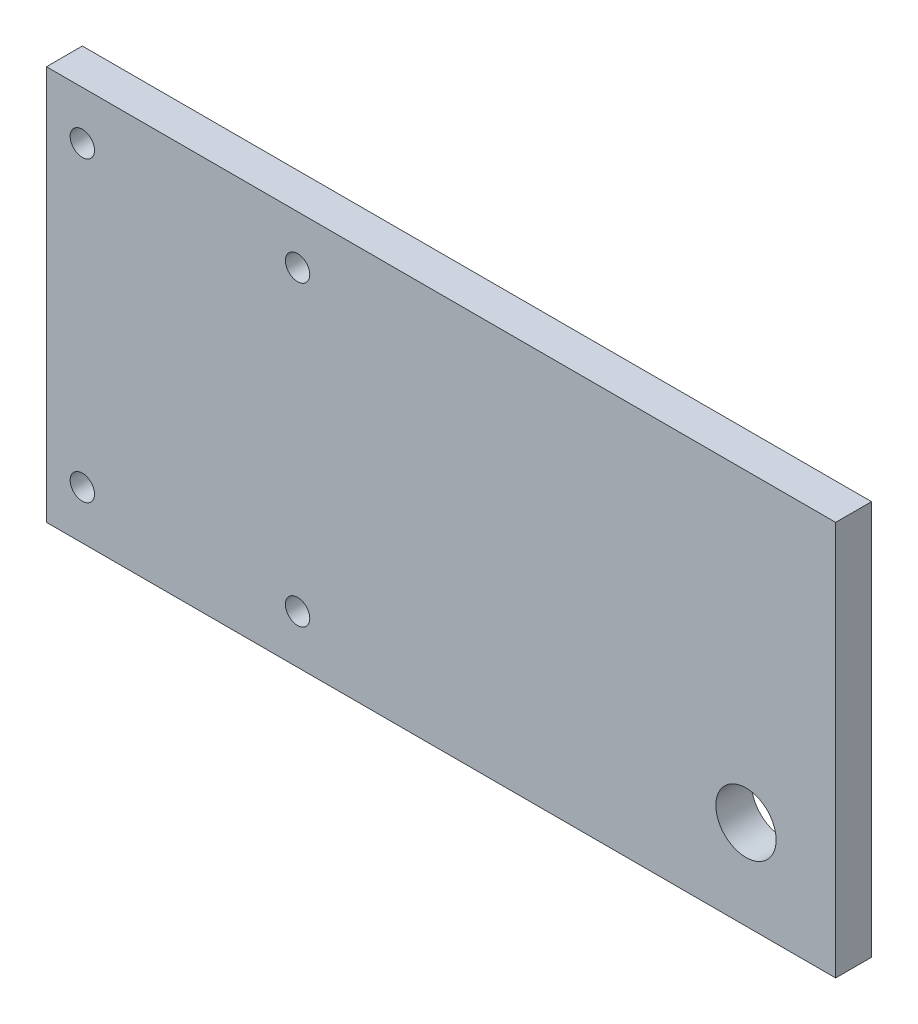
ISO-10303-21;
HEADER;
FILE_DESCRIPTION(('STEP AP214'),'2;1');
FILE_NAME('part.step','',(''),(''),'','','');
FILE_SCHEMA(('AUTOMOTIVE_DESIGN { 1 0 10303 214 1 1 1 1 }'));
ENDSEC;
DATA;
#1=APPLICATION_CONTEXT('core data for automotive mechanical design processes');
#2=APPLICATION_PROTOCOL_DEFINITION('international standard','automotive_design',2000,#1);
#3=PRODUCT_CONTEXT('',#1,'mechanical');
#4=PRODUCT('Part','Part','',(#3));
#5=PRODUCT_RELATED_PRODUCT_CATEGORY('part','',(#4));
#6=PRODUCT_DEFINITION_FORMATION('','',#4);
#7=PRODUCT_DEFINITION_CONTEXT('part definition',#1,'design');
#8=PRODUCT_DEFINITION('design','',#6,#7);
#9=PRODUCT_DEFINITION_SHAPE('','',#8);
#10=(LENGTH_UNIT() NAMED_UNIT(*) SI_UNIT(.MILLI.,.METRE.));
#11=(NAMED_UNIT(*) PLANE_ANGLE_UNIT() SI_UNIT($,.RADIAN.));
#12=(NAMED_UNIT(*) SI_UNIT($,.STERADIAN.) SOLID_ANGLE_UNIT());
#13=UNCERTAINTY_MEASURE_WITH_UNIT(LENGTH_MEASURE(1.E-05),#10,'distance_accuracy_value','');
#14=(GEOMETRIC_REPRESENTATION_CONTEXT(3) GLOBAL_UNCERTAINTY_ASSIGNED_CONTEXT((#13)) GLOBAL_UNIT_ASSIGNED_CONTEXT((#10,
#11,#12)) REPRESENTATION_CONTEXT('',''));
#15=CARTESIAN_POINT('',(0.,0.,0.));
#16=DIRECTION('',(0.,0.,1.));
#17=DIRECTION('',(1.,0.,0.));
#18=AXIS2_PLACEMENT_3D('',#15,#16,#17);
#19=CARTESIAN_POINT('',(0.,0.,2010.));
#20=DIRECTION('',(0.,0.,1.));
#21=DIRECTION('',(1.,0.,0.));
#22=AXIS2_PLACEMENT_3D('',#19,#20,#21);
#23=PLANE('',#22);
#24=CARTESIAN_POINT('',(250.,-403.5,2010.));
#25=DIRECTION('',(0.,0.,1.));
#26=DIRECTION('',(1.,0.,0.));
#27=AXIS2_PLACEMENT_3D('',#24,#25,#26);
#28=CIRCLE('',#27,3.40000000000003);
#29=CARTESIAN_POINT('',(253.4,-403.5,2010.));
#30=VERTEX_POINT('',#29);
#31=EDGE_CURVE('E109',#30,#30,#28,.T.);
#32=ORIENTED_EDGE('',*,*,#31,.F.);
#33=EDGE_LOOP('',(#32));
#34=FACE_BOUND('',#33,.T.);
#35=CARTESIAN_POINT('',(190.,-486.5,2010.));
#36=DIRECTION('',(0.,0.,1.));
#37=DIRECTION('',(1.,0.,0.));
#38=AXIS2_PLACEMENT_3D('',#35,#36,#37);
#39=CIRCLE('',#38,3.40000000000003);
#40=CARTESIAN_POINT('',(193.4,-486.5,2010.));
#41=VERTEX_POINT('',#40);
#42=EDGE_CURVE('E97',#41,#41,#39,.T.);
#43=ORIENTED_EDGE('',*,*,#42,.F.);
#44=EDGE_LOOP('',(#43));
#45=FACE_BOUND('',#44,.T.);
#46=DIRECTION('',(0.,1.,0.));
#47=VECTOR('',#46,1.);
#48=CARTESIAN_POINT('',(400.,-500.,2010.));
#49=LINE('',#48,#47);
#50=CARTESIAN_POINT('',(400.,-500.,2010.));
#51=VERTEX_POINT('',#50);
#52=CARTESIAN_POINT('',(400.,-390.,2010.));
#53=VERTEX_POINT('',#52);
#54=EDGE_CURVE('E67',#51,#53,#49,.T.);
#55=ORIENTED_EDGE('',*,*,#54,.T.);
#56=DIRECTION('',(-1.,0.,0.));
#57=VECTOR('',#56,1.);
#58=CARTESIAN_POINT('',(400.,-390.,2010.));
#59=LINE('',#58,#57);
#60=CARTESIAN_POINT('',(180.,-390.,2010.));
#61=VERTEX_POINT('',#60);
#62=EDGE_CURVE('E62',#53,#61,#59,.T.);
#63=ORIENTED_EDGE('',*,*,#62,.T.);
#64=DIRECTION('',(0.,-1.,0.));
#65=VECTOR('',#64,1.);
#66=CARTESIAN_POINT('',(180.,-500.,2010.));
#67=LINE('',#66,#65);
#68=CARTESIAN_POINT('',(180.,-500.,2010.));
#69=VERTEX_POINT('',#68);
#70=EDGE_CURVE('E65',#61,#69,#67,.T.);
#71=ORIENTED_EDGE('',*,*,#70,.T.);
#72=DIRECTION('',(1.,0.,0.));
#73=VECTOR('',#72,1.);
#74=CARTESIAN_POINT('',(400.,-500.,2010.));
#75=LINE('',#74,#73);
#76=EDGE_CURVE('E32',#69,#51,#75,.T.);
#77=ORIENTED_EDGE('',*,*,#76,.T.);
#78=EDGE_LOOP('',(#55,#63,#71,#77));
#79=FACE_BOUND('',#78,.T.);
#80=CARTESIAN_POINT('',(375.,-475.,2010.));
#81=DIRECTION('',(0.,0.,1.));
#82=DIRECTION('',(1.,0.,0.));
#83=AXIS2_PLACEMENT_3D('',#80,#81,#82);
#84=CIRCLE('',#83,8.40000000000002);
#85=CARTESIAN_POINT('',(383.4,-475.,2010.));
#86=VERTEX_POINT('',#85);
#87=EDGE_CURVE('E82',#86,#86,#84,.T.);
#88=ORIENTED_EDGE('',*,*,#87,.F.);
#89=EDGE_LOOP('',(#88));
#90=FACE_BOUND('',#89,.T.);
#91=CARTESIAN_POINT('',(190.,-403.5,2010.));
#92=DIRECTION('',(0.,0.,1.));
#93=DIRECTION('',(1.,0.,0.));
#94=AXIS2_PLACEMENT_3D('',#91,#92,#93);
#95=CIRCLE('',#94,3.40000000000003);
#96=CARTESIAN_POINT('',(193.4,-403.5,2010.));
#97=VERTEX_POINT('',#96);
#98=EDGE_CURVE('E103',#97,#97,#95,.T.);
#99=ORIENTED_EDGE('',*,*,#98,.F.);
#100=EDGE_LOOP('',(#99));
#101=FACE_BOUND('',#100,.T.);
#102=CARTESIAN_POINT('',(250.,-486.5,2010.));
#103=DIRECTION('',(0.,0.,1.));
#104=DIRECTION('',(1.,0.,0.));
#105=AXIS2_PLACEMENT_3D('',#102,#103,#104);
#106=CIRCLE('',#105,3.40000000000003);
#107=CARTESIAN_POINT('',(253.4,-486.5,2010.));
#108=VERTEX_POINT('',#107);
#109=EDGE_CURVE('E115',#108,#108,#106,.T.);
#110=ORIENTED_EDGE('',*,*,#109,.F.);
#111=EDGE_LOOP('',(#110));
#112=FACE_BOUND('',#111,.T.);
#113=ADVANCED_FACE('F15',(#34,#45,#79,#90,#101,#112),#23,.T.);
#114=CARTESIAN_POINT('',(0.,0.,2000.));
#115=DIRECTION('',(0.,0.,1.));
#116=DIRECTION('',(1.,0.,0.));
#117=AXIS2_PLACEMENT_3D('',#114,#115,#116);
#118=PLANE('',#117);
#119=DIRECTION('',(0.,1.,0.));
#120=VECTOR('',#119,1.);
#121=CARTESIAN_POINT('',(400.,-500.,2000.));
#122=LINE('',#121,#120);
#123=CARTESIAN_POINT('',(400.,-500.,2000.));
#124=VERTEX_POINT('',#123);
#125=CARTESIAN_POINT('',(400.,-390.,2000.));
#126=VERTEX_POINT('',#125);
#127=EDGE_CURVE('E79',#124,#126,#122,.T.);
#128=ORIENTED_EDGE('',*,*,#127,.F.);
#129=DIRECTION('',(1.,0.,0.));
#130=VECTOR('',#129,1.);
#131=CARTESIAN_POINT('',(400.,-500.,2000.));
#132=LINE('',#131,#130);
#133=CARTESIAN_POINT('',(180.,-500.,2000.));
#134=VERTEX_POINT('',#133);
#135=EDGE_CURVE('E55',#134,#124,#132,.T.);
#136=ORIENTED_EDGE('',*,*,#135,.F.);
#137=DIRECTION('',(0.,-1.,0.));
#138=VECTOR('',#137,1.);
#139=CARTESIAN_POINT('',(180.,-500.,2000.));
#140=LINE('',#139,#138);
#141=CARTESIAN_POINT('',(180.,-390.,2000.));
#142=VERTEX_POINT('',#141);
#143=EDGE_CURVE('E49',#142,#134,#140,.T.);
#144=ORIENTED_EDGE('',*,*,#143,.F.);
#145=DIRECTION('',(-1.,0.,0.));
#146=VECTOR('',#145,1.);
#147=CARTESIAN_POINT('',(400.,-390.,2000.));
#148=LINE('',#147,#146);
#149=EDGE_CURVE('E71',#126,#142,#148,.T.);
#150=ORIENTED_EDGE('',*,*,#149,.F.);
#151=EDGE_LOOP('',(#128,#136,#144,#150));
#152=FACE_BOUND('',#151,.T.);
#153=CARTESIAN_POINT('',(375.,-475.,2000.));
#154=DIRECTION('',(0.,0.,1.));
#155=DIRECTION('',(1.,0.,0.));
#156=AXIS2_PLACEMENT_3D('',#153,#154,#155);
#157=CIRCLE('',#156,8.40000000000002);
#158=CARTESIAN_POINT('',(383.4,-475.,2000.));
#159=VERTEX_POINT('',#158);
#160=EDGE_CURVE('E94',#159,#159,#157,.T.);
#161=ORIENTED_EDGE('',*,*,#160,.T.);
#162=EDGE_LOOP('',(#161));
#163=FACE_BOUND('',#162,.T.);
#164=CARTESIAN_POINT('',(190.,-486.5,2000.));
#165=DIRECTION('',(0.,0.,1.));
#166=DIRECTION('',(1.,0.,0.));
#167=AXIS2_PLACEMENT_3D('',#164,#165,#166);
#168=CIRCLE('',#167,3.40000000000003);
#169=CARTESIAN_POINT('',(193.4,-486.5,2000.));
#170=VERTEX_POINT('',#169);
#171=EDGE_CURVE('E100',#170,#170,#168,.T.);
#172=ORIENTED_EDGE('',*,*,#171,.T.);
#173=EDGE_LOOP('',(#172));
#174=FACE_BOUND('',#173,.T.);
#175=CARTESIAN_POINT('',(190.,-403.5,2000.));
#176=DIRECTION('',(0.,0.,1.));
#177=DIRECTION('',(1.,0.,0.));
#178=AXIS2_PLACEMENT_3D('',#175,#176,#177);
#179=CIRCLE('',#178,3.40000000000003);
#180=CARTESIAN_POINT('',(193.4,-403.5,2000.));
#181=VERTEX_POINT('',#180);
#182=EDGE_CURVE('E106',#181,#181,#179,.T.);
#183=ORIENTED_EDGE('',*,*,#182,.T.);
#184=EDGE_LOOP('',(#183));
#185=FACE_BOUND('',#184,.T.);
#186=CARTESIAN_POINT('',(250.,-403.5,2000.));
#187=DIRECTION('',(0.,0.,1.));
#188=DIRECTION('',(1.,0.,0.));
#189=AXIS2_PLACEMENT_3D('',#186,#187,#188);
#190=CIRCLE('',#189,3.40000000000003);
#191=CARTESIAN_POINT('',(253.4,-403.5,2000.));
#192=VERTEX_POINT('',#191);
#193=EDGE_CURVE('E112',#192,#192,#190,.T.);
#194=ORIENTED_EDGE('',*,*,#193,.T.);
#195=EDGE_LOOP('',(#194));
#196=FACE_BOUND('',#195,.T.);
#197=CARTESIAN_POINT('',(250.,-486.5,2000.));
#198=DIRECTION('',(0.,0.,1.));
#199=DIRECTION('',(1.,0.,0.));
#200=AXIS2_PLACEMENT_3D('',#197,#198,#199);
#201=CIRCLE('',#200,3.40000000000003);
#202=CARTESIAN_POINT('',(253.4,-486.5,2000.));
#203=VERTEX_POINT('',#202);
#204=EDGE_CURVE('E118',#203,#203,#201,.T.);
#205=ORIENTED_EDGE('',*,*,#204,.T.);
#206=EDGE_LOOP('',(#205));
#207=FACE_BOUND('',#206,.T.);
#208=ADVANCED_FACE('F90',(#152,#163,#174,#185,#196,#207),#118,.F.);
#209=CARTESIAN_POINT('',(400.,-500.,2010.));
#210=DIRECTION('',(-1.,0.,0.));
#211=DIRECTION('',(0.,0.,1.));
#212=AXIS2_PLACEMENT_3D('',#209,#210,#211);
#213=PLANE('',#212);
#214=ORIENTED_EDGE('',*,*,#127,.T.);
#215=DIRECTION('',(0.,0.,-1.));
#216=VECTOR('',#215,1.);
#217=CARTESIAN_POINT('',(400.,-390.,2010.));
#218=LINE('',#217,#216);
#219=EDGE_CURVE('E10',#53,#126,#218,.T.);
#220=ORIENTED_EDGE('',*,*,#219,.F.);
#221=ORIENTED_EDGE('',*,*,#54,.F.);
#222=DIRECTION('',(0.,0.,-1.));
#223=VECTOR('',#222,1.);
#224=CARTESIAN_POINT('',(400.,-500.,2010.));
#225=LINE('',#224,#223);
#226=EDGE_CURVE('E75',#51,#124,#225,.T.);
#227=ORIENTED_EDGE('',*,*,#226,.T.);
#228=EDGE_LOOP('',(#214,#220,#221,#227));
#229=FACE_BOUND('',#228,.T.);
#230=ADVANCED_FACE('F17',(#229),#213,.F.);
#231=CARTESIAN_POINT('',(400.,-390.,2010.));
#232=DIRECTION('',(0.,-1.,0.));
#233=DIRECTION('',(0.,0.,-1.));
#234=AXIS2_PLACEMENT_3D('',#231,#232,#233);
#235=PLANE('',#234);
#236=ORIENTED_EDGE('',*,*,#149,.T.);
#237=DIRECTION('',(0.,0.,-1.));
#238=VECTOR('',#237,1.);
#239=CARTESIAN_POINT('',(180.,-390.,2010.));
#240=LINE('',#239,#238);
#241=EDGE_CURVE('E24',#61,#142,#240,.T.);
#242=ORIENTED_EDGE('',*,*,#241,.F.);
#243=ORIENTED_EDGE('',*,*,#62,.F.);
#244=ORIENTED_EDGE('',*,*,#219,.T.);
#245=EDGE_LOOP('',(#236,#242,#243,#244));
#246=FACE_BOUND('',#245,.T.);
#247=ADVANCED_FACE('F70',(#246),#235,.F.);
#248=CARTESIAN_POINT('',(180.,-500.,2010.));
#249=DIRECTION('',(1.,0.,0.));
#250=DIRECTION('',(0.,0.,-1.));
#251=AXIS2_PLACEMENT_3D('',#248,#249,#250);
#252=PLANE('',#251);
#253=ORIENTED_EDGE('',*,*,#143,.T.);
#254=DIRECTION('',(0.,0.,-1.));
#255=VECTOR('',#254,1.);
#256=CARTESIAN_POINT('',(180.,-500.,2010.));
#257=LINE('',#256,#255);
#258=EDGE_CURVE('E72',#69,#134,#257,.T.);
#259=ORIENTED_EDGE('',*,*,#258,.F.);
#260=ORIENTED_EDGE('',*,*,#70,.F.);
#261=ORIENTED_EDGE('',*,*,#241,.T.);
#262=EDGE_LOOP('',(#253,#259,#260,#261));
#263=FACE_BOUND('',#262,.T.);
#264=ADVANCED_FACE('F73',(#263),#252,.F.);
#265=CARTESIAN_POINT('',(400.,-500.,2010.));
#266=DIRECTION('',(0.,1.,0.));
#267=DIRECTION('',(0.,0.,1.));
#268=AXIS2_PLACEMENT_3D('',#265,#266,#267);
#269=PLANE('',#268);
#270=ORIENTED_EDGE('',*,*,#135,.T.);
#271=ORIENTED_EDGE('',*,*,#226,.F.);
#272=ORIENTED_EDGE('',*,*,#76,.F.);
#273=ORIENTED_EDGE('',*,*,#258,.T.);
#274=EDGE_LOOP('',(#270,#271,#272,#273));
#275=FACE_BOUND('',#274,.T.);
#276=ADVANCED_FACE('F87',(#275),#269,.F.);
#277=CARTESIAN_POINT('',(375.,-475.,2010.));
#278=DIRECTION('',(0.,0.,-1.));
#279=DIRECTION('',(-1.,0.,0.));
#280=AXIS2_PLACEMENT_3D('',#277,#278,#279);
#281=CYLINDRICAL_SURFACE('',#280,8.40000000000002);
#282=ORIENTED_EDGE('',*,*,#87,.T.);
#283=EDGE_LOOP('',(#282));
#284=FACE_BOUND('',#283,.T.);
#285=ORIENTED_EDGE('',*,*,#160,.F.);
#286=EDGE_LOOP('',(#285));
#287=FACE_BOUND('',#286,.T.);
#288=ADVANCED_FACE('F138',(#284,#287),#281,.F.);
#289=CARTESIAN_POINT('',(190.,-486.5,2010.));
#290=DIRECTION('',(0.,0.,-1.));
#291=DIRECTION('',(-1.,0.,0.));
#292=AXIS2_PLACEMENT_3D('',#289,#290,#291);
#293=CYLINDRICAL_SURFACE('',#292,3.40000000000003);
#294=ORIENTED_EDGE('',*,*,#42,.T.);
#295=EDGE_LOOP('',(#294));
#296=FACE_BOUND('',#295,.T.);
#297=ORIENTED_EDGE('',*,*,#171,.F.);
#298=EDGE_LOOP('',(#297));
#299=FACE_BOUND('',#298,.T.);
#300=ADVANCED_FACE('F190',(#296,#299),#293,.F.);
#301=CARTESIAN_POINT('',(190.,-403.5,2010.));
#302=DIRECTION('',(0.,0.,-1.));
#303=DIRECTION('',(-1.,0.,0.));
#304=AXIS2_PLACEMENT_3D('',#301,#302,#303);
#305=CYLINDRICAL_SURFACE('',#304,3.40000000000003);
#306=ORIENTED_EDGE('',*,*,#98,.T.);
#307=EDGE_LOOP('',(#306));
#308=FACE_BOUND('',#307,.T.);
#309=ORIENTED_EDGE('',*,*,#182,.F.);
#310=EDGE_LOOP('',(#309));
#311=FACE_BOUND('',#310,.T.);
#312=ADVANCED_FACE('F198',(#308,#311),#305,.F.);
#313=CARTESIAN_POINT('',(250.,-403.5,2010.));
#314=DIRECTION('',(0.,0.,-1.));
#315=DIRECTION('',(-1.,0.,0.));
#316=AXIS2_PLACEMENT_3D('',#313,#314,#315);
#317=CYLINDRICAL_SURFACE('',#316,3.40000000000003);
#318=ORIENTED_EDGE('',*,*,#31,.T.);
#319=EDGE_LOOP('',(#318));
#320=FACE_BOUND('',#319,.T.);
#321=ORIENTED_EDGE('',*,*,#193,.F.);
#322=EDGE_LOOP('',(#321));
#323=FACE_BOUND('',#322,.T.);
#324=ADVANCED_FACE('F206',(#320,#323),#317,.F.);
#325=CARTESIAN_POINT('',(250.,-486.5,2010.));
#326=DIRECTION('',(0.,0.,-1.));
#327=DIRECTION('',(-1.,0.,0.));
#328=AXIS2_PLACEMENT_3D('',#325,#326,#327);
#329=CYLINDRICAL_SURFACE('',#328,3.40000000000003);
#330=ORIENTED_EDGE('',*,*,#109,.T.);
#331=EDGE_LOOP('',(#330));
#332=FACE_BOUND('',#331,.T.);
#333=ORIENTED_EDGE('',*,*,#204,.F.);
#334=EDGE_LOOP('',(#333));
#335=FACE_BOUND('',#334,.T.);
#336=ADVANCED_FACE('F124',(#332,#335),#329,.F.);
#337=CLOSED_SHELL('',(#113,#208,#230,#247,#264,#276,#288,#300,#312,#324,#336));
#338=MANIFOLD_SOLID_BREP('B1',#337);
#339=ADVANCED_BREP_SHAPE_REPRESENTATION('',(#18,#338),#14);
#340=SHAPE_DEFINITION_REPRESENTATION(#9,#339);
ENDSEC;
END-ISO-10303-21;
